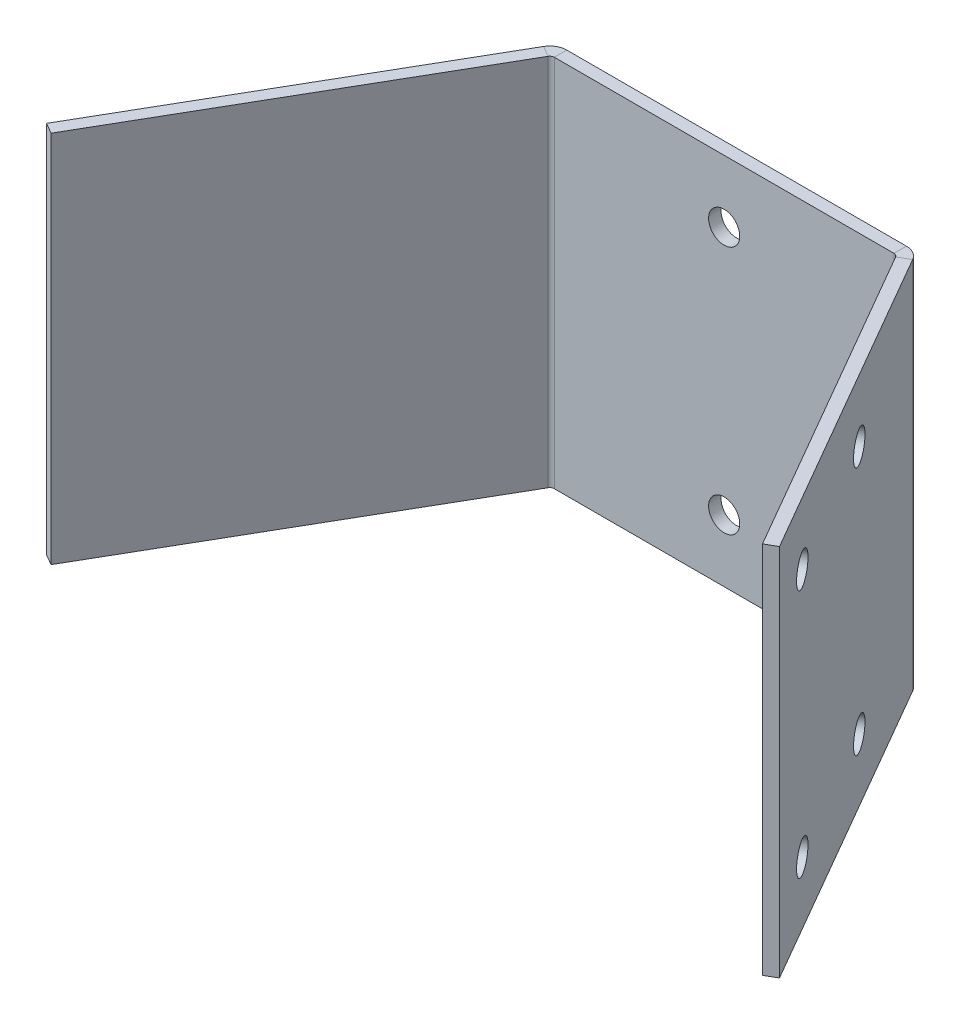
ISO-10303-21;
HEADER;
FILE_DESCRIPTION(('STEP AP214'),'2;1');
FILE_NAME('part.step','',(''),(''),'','','');
FILE_SCHEMA(('AUTOMOTIVE_DESIGN { 1 0 10303 214 1 1 1 1 }'));
ENDSEC;
DATA;
#1=APPLICATION_CONTEXT('core data for automotive mechanical design processes');
#2=APPLICATION_PROTOCOL_DEFINITION('international standard','automotive_design',2000,#1);
#3=PRODUCT_CONTEXT('',#1,'mechanical');
#4=PRODUCT('Part','Part','',(#3));
#5=PRODUCT_RELATED_PRODUCT_CATEGORY('part','',(#4));
#6=PRODUCT_DEFINITION_FORMATION('','',#4);
#7=PRODUCT_DEFINITION_CONTEXT('part definition',#1,'design');
#8=PRODUCT_DEFINITION('design','',#6,#7);
#9=PRODUCT_DEFINITION_SHAPE('','',#8);
#10=(LENGTH_UNIT() NAMED_UNIT(*) SI_UNIT(.MILLI.,.METRE.));
#11=(NAMED_UNIT(*) PLANE_ANGLE_UNIT() SI_UNIT($,.RADIAN.));
#12=(NAMED_UNIT(*) SI_UNIT($,.STERADIAN.) SOLID_ANGLE_UNIT());
#13=UNCERTAINTY_MEASURE_WITH_UNIT(LENGTH_MEASURE(1.E-05),#10,'distance_accuracy_value','');
#14=(GEOMETRIC_REPRESENTATION_CONTEXT(3) GLOBAL_UNCERTAINTY_ASSIGNED_CONTEXT((#13)) GLOBAL_UNIT_ASSIGNED_CONTEXT((#10,
#11,#12)) REPRESENTATION_CONTEXT('',''));
#15=CARTESIAN_POINT('',(0.,0.,0.));
#16=DIRECTION('',(0.,0.,1.));
#17=DIRECTION('',(1.,0.,0.));
#18=AXIS2_PLACEMENT_3D('',#15,#16,#17);
#19=CARTESIAN_POINT('',(0.,0.,-2.));
#20=DIRECTION('',(0.,0.,1.));
#21=DIRECTION('',(1.,0.,0.));
#22=AXIS2_PLACEMENT_3D('',#19,#20,#21);
#23=PLANE('',#22);
#24=CARTESIAN_POINT('',(0.,-20.,-2.));
#25=DIRECTION('',(0.,0.,-1.));
#26=DIRECTION('',(1.,0.,0.));
#27=AXIS2_PLACEMENT_3D('',#24,#25,#26);
#28=CIRCLE('',#27,2.5);
#29=CARTESIAN_POINT('',(2.50000000000001,-20.,-2.));
#30=VERTEX_POINT('',#29);
#31=EDGE_CURVE('E296',#30,#30,#28,.T.);
#32=ORIENTED_EDGE('',*,*,#31,.F.);
#33=EDGE_LOOP('',(#32));
#34=FACE_BOUND('',#33,.T.);
#35=CARTESIAN_POINT('',(0.,20.,-2.));
#36=DIRECTION('',(0.,0.,-1.));
#37=DIRECTION('',(-1.,0.,0.));
#38=AXIS2_PLACEMENT_3D('',#35,#36,#37);
#39=CIRCLE('',#38,2.5);
#40=CARTESIAN_POINT('',(-2.5,20.,-2.));
#41=VERTEX_POINT('',#40);
#42=EDGE_CURVE('E292',#41,#41,#39,.T.);
#43=ORIENTED_EDGE('',*,*,#42,.F.);
#44=EDGE_LOOP('',(#43));
#45=FACE_BOUND('',#44,.T.);
#46=DIRECTION('',(0.,-1.,0.));
#47=VECTOR('',#46,1.);
#48=CARTESIAN_POINT('',(-27.2653227149564,-30.,-2.00000000000001));
#49=LINE('',#48,#47);
#50=CARTESIAN_POINT('',(-27.2653227149564,-30.,-2.00000000000001));
#51=VERTEX_POINT('',#50);
#52=CARTESIAN_POINT('',(-27.2653227149564,30.,-2.));
#53=VERTEX_POINT('',#52);
#54=EDGE_CURVE('E211',#51,#53,#49,.F.);
#55=ORIENTED_EDGE('',*,*,#54,.T.);
#56=DIRECTION('',(-1.,0.,0.));
#57=VECTOR('',#56,1.);
#58=CARTESIAN_POINT('',(-30.,30.,-2.));
#59=LINE('',#58,#57);
#60=CARTESIAN_POINT('',(27.2653227149564,30.,-1.99999999999999));
#61=VERTEX_POINT('',#60);
#62=EDGE_CURVE('E86',#61,#53,#59,.T.);
#63=ORIENTED_EDGE('',*,*,#62,.F.);
#64=DIRECTION('',(0.,1.,0.));
#65=VECTOR('',#64,1.);
#66=CARTESIAN_POINT('',(27.2653227149564,30.,-1.99999999999999));
#67=LINE('',#66,#65);
#68=CARTESIAN_POINT('',(27.2653227149564,-30.,-2.));
#69=VERTEX_POINT('',#68);
#70=EDGE_CURVE('E264',#61,#69,#67,.F.);
#71=ORIENTED_EDGE('',*,*,#70,.T.);
#72=DIRECTION('',(1.,0.,0.));
#73=VECTOR('',#72,1.);
#74=CARTESIAN_POINT('',(-30.,-30.,-2.));
#75=LINE('',#74,#73);
#76=EDGE_CURVE('E13',#51,#69,#75,.T.);
#77=ORIENTED_EDGE('',*,*,#76,.F.);
#78=EDGE_LOOP('',(#55,#63,#71,#77));
#79=FACE_BOUND('',#78,.T.);
#80=ADVANCED_FACE('F77',(#34,#45,#79),#23,.F.);
#81=CARTESIAN_POINT('',(0.,0.,0.));
#82=DIRECTION('',(0.,0.,1.));
#83=DIRECTION('',(1.,0.,0.));
#84=AXIS2_PLACEMENT_3D('',#81,#82,#83);
#85=PLANE('',#84);
#86=CARTESIAN_POINT('',(0.,-20.,0.));
#87=DIRECTION('',(0.,0.,1.));
#88=DIRECTION('',(1.,0.,0.));
#89=AXIS2_PLACEMENT_3D('',#86,#87,#88);
#90=CIRCLE('',#89,2.5);
#91=CARTESIAN_POINT('',(2.50000000000001,-20.,0.));
#92=VERTEX_POINT('',#91);
#93=EDGE_CURVE('E293',#92,#92,#90,.T.);
#94=ORIENTED_EDGE('',*,*,#93,.F.);
#95=EDGE_LOOP('',(#94));
#96=FACE_BOUND('',#95,.T.);
#97=CARTESIAN_POINT('',(0.,20.,0.));
#98=DIRECTION('',(0.,0.,1.));
#99=DIRECTION('',(1.,0.,0.));
#100=AXIS2_PLACEMENT_3D('',#97,#98,#99);
#101=CIRCLE('',#100,2.5);
#102=CARTESIAN_POINT('',(2.5,20.,0.));
#103=VERTEX_POINT('',#102);
#104=EDGE_CURVE('E210',#103,#103,#101,.T.);
#105=ORIENTED_EDGE('',*,*,#104,.F.);
#106=EDGE_LOOP('',(#105));
#107=FACE_BOUND('',#106,.T.);
#108=DIRECTION('',(-1.,0.,0.));
#109=VECTOR('',#108,1.);
#110=CARTESIAN_POINT('',(-30.,30.,0.));
#111=LINE('',#110,#109);
#112=CARTESIAN_POINT('',(27.2653227149564,30.,0.));
#113=VERTEX_POINT('',#112);
#114=CARTESIAN_POINT('',(-27.2653227149564,30.,0.));
#115=VERTEX_POINT('',#114);
#116=EDGE_CURVE('E282',#113,#115,#111,.T.);
#117=ORIENTED_EDGE('',*,*,#116,.T.);
#118=DIRECTION('',(0.,-1.,0.));
#119=VECTOR('',#118,1.);
#120=CARTESIAN_POINT('',(-27.2653227149564,-30.,0.));
#121=LINE('',#120,#119);
#122=CARTESIAN_POINT('',(-27.2653227149564,-30.,0.));
#123=VERTEX_POINT('',#122);
#124=EDGE_CURVE('E223',#123,#115,#121,.F.);
#125=ORIENTED_EDGE('',*,*,#124,.F.);
#126=DIRECTION('',(1.,0.,0.));
#127=VECTOR('',#126,1.);
#128=CARTESIAN_POINT('',(-30.,-30.,0.));
#129=LINE('',#128,#127);
#130=CARTESIAN_POINT('',(27.2653227149564,-30.,0.));
#131=VERTEX_POINT('',#130);
#132=EDGE_CURVE('E286',#123,#131,#129,.T.);
#133=ORIENTED_EDGE('',*,*,#132,.T.);
#134=DIRECTION('',(0.,1.,0.));
#135=VECTOR('',#134,1.);
#136=CARTESIAN_POINT('',(27.2653227149564,30.,0.));
#137=LINE('',#136,#135);
#138=EDGE_CURVE('E94',#113,#131,#137,.F.);
#139=ORIENTED_EDGE('',*,*,#138,.F.);
#140=EDGE_LOOP('',(#117,#125,#133,#139));
#141=FACE_BOUND('',#140,.T.);
#142=ADVANCED_FACE('F348',(#96,#107,#141),#85,.T.);
#143=CARTESIAN_POINT('',(-30.,-30.,-2.));
#144=DIRECTION('',(0.,-1.,0.));
#145=DIRECTION('',(0.,0.,-1.));
#146=AXIS2_PLACEMENT_3D('',#143,#144,#145);
#147=PLANE('',#146);
#148=ORIENTED_EDGE('',*,*,#132,.F.);
#149=DIRECTION('',(0.,0.,-1.));
#150=VECTOR('',#149,1.);
#151=CARTESIAN_POINT('',(-27.2653227149564,-30.,0.));
#152=LINE('',#151,#150);
#153=EDGE_CURVE('E217',#123,#51,#152,.T.);
#154=ORIENTED_EDGE('',*,*,#153,.T.);
#155=ORIENTED_EDGE('',*,*,#76,.T.);
#156=DIRECTION('',(0.,0.,-1.));
#157=VECTOR('',#156,1.);
#158=CARTESIAN_POINT('',(27.2653227149564,-30.,0.));
#159=LINE('',#158,#157);
#160=EDGE_CURVE('E279',#131,#69,#159,.T.);
#161=ORIENTED_EDGE('',*,*,#160,.F.);
#162=EDGE_LOOP('',(#148,#154,#155,#161));
#163=FACE_BOUND('',#162,.T.);
#164=ADVANCED_FACE('F354',(#163),#147,.T.);
#165=CARTESIAN_POINT('',(-30.,30.,-2.));
#166=DIRECTION('',(0.,1.,0.));
#167=DIRECTION('',(0.,0.,1.));
#168=AXIS2_PLACEMENT_3D('',#165,#166,#167);
#169=PLANE('',#168);
#170=DIRECTION('',(0.,0.,-1.));
#171=VECTOR('',#170,1.);
#172=CARTESIAN_POINT('',(-27.2653227149564,30.,0.));
#173=LINE('',#172,#171);
#174=EDGE_CURVE('E229',#115,#53,#173,.T.);
#175=ORIENTED_EDGE('',*,*,#174,.F.);
#176=ORIENTED_EDGE('',*,*,#116,.F.);
#177=DIRECTION('',(0.,0.,-1.));
#178=VECTOR('',#177,1.);
#179=CARTESIAN_POINT('',(27.2653227149564,30.,0.));
#180=LINE('',#179,#178);
#181=EDGE_CURVE('E270',#113,#61,#180,.T.);
#182=ORIENTED_EDGE('',*,*,#181,.T.);
#183=ORIENTED_EDGE('',*,*,#62,.T.);
#184=EDGE_LOOP('',(#175,#176,#182,#183));
#185=FACE_BOUND('',#184,.T.);
#186=ADVANCED_FACE('F79',(#185),#169,.T.);
#187=CARTESIAN_POINT('',(27.2653227149564,-30.,0.736599999999996));
#188=DIRECTION('',(0.,-1.,0.));
#189=DIRECTION('',(0.,0.,-1.));
#190=AXIS2_PLACEMENT_3D('',#187,#188,#189);
#191=PLANE('',#190);
#192=DIRECTION('',(-0.866025403784436,0.,0.500000000000004));
#193=VECTOR('',#192,1.);
#194=CARTESIAN_POINT('',(29.6352878349529,-30.,-0.631700000000012));
#195=LINE('',#194,#193);
#196=CARTESIAN_POINT('',(27.903237027384,-30.,0.368299999999994));
#197=VERTEX_POINT('',#196);
#198=CARTESIAN_POINT('',(29.6352878349529,-30.,-0.631700000000011));
#199=VERTEX_POINT('',#198);
#200=EDGE_CURVE('E232',#197,#199,#195,.F.);
#201=ORIENTED_EDGE('',*,*,#200,.F.);
#202=CARTESIAN_POINT('',(27.2653227149564,-30.,0.736599999999996));
#203=DIRECTION('',(0.,1.,0.));
#204=DIRECTION('',(0.,0.,1.));
#205=AXIS2_PLACEMENT_3D('',#202,#203,#204);
#206=CIRCLE('',#205,0.736599999999998);
#207=EDGE_CURVE('E273',#131,#197,#206,.F.);
#208=ORIENTED_EDGE('',*,*,#207,.F.);
#209=ORIENTED_EDGE('',*,*,#160,.T.);
#210=CARTESIAN_POINT('',(27.2653227149564,-30.,0.736599999999996));
#211=DIRECTION('',(0.,1.,0.));
#212=DIRECTION('',(0.,0.,1.));
#213=AXIS2_PLACEMENT_3D('',#210,#211,#212);
#214=CIRCLE('',#213,2.7366);
#215=EDGE_CURVE('E266',#69,#199,#214,.F.);
#216=ORIENTED_EDGE('',*,*,#215,.T.);
#217=EDGE_LOOP('',(#201,#208,#209,#216));
#218=FACE_BOUND('',#217,.T.);
#219=ADVANCED_FACE('F366',(#218),#191,.T.);
#220=CARTESIAN_POINT('',(27.2653227149564,30.,0.736600000000005));
#221=DIRECTION('',(0.,-1.,0.));
#222=DIRECTION('',(0.,0.,-1.));
#223=AXIS2_PLACEMENT_3D('',#220,#221,#222);
#224=PLANE('',#223);
#225=CARTESIAN_POINT('',(27.2653227149564,30.,0.736600000000005));
#226=DIRECTION('',(0.,1.,0.));
#227=DIRECTION('',(0.,0.,1.));
#228=AXIS2_PLACEMENT_3D('',#225,#226,#227);
#229=CIRCLE('',#228,0.736599999999998);
#230=CARTESIAN_POINT('',(27.903237027384,30.,0.368300000000003));
#231=VERTEX_POINT('',#230);
#232=EDGE_CURVE('E237',#231,#113,#229,.T.);
#233=ORIENTED_EDGE('',*,*,#232,.F.);
#234=DIRECTION('',(-0.866025403784436,0.,0.500000000000004));
#235=VECTOR('',#234,1.);
#236=CARTESIAN_POINT('',(27.903237027384,30.,0.368299999999999));
#237=LINE('',#236,#235);
#238=CARTESIAN_POINT('',(29.6352878349529,30.,-0.631700000000007));
#239=VERTEX_POINT('',#238);
#240=EDGE_CURVE('E257',#231,#239,#237,.F.);
#241=ORIENTED_EDGE('',*,*,#240,.T.);
#242=CARTESIAN_POINT('',(27.2653227149564,30.,0.736600000000005));
#243=DIRECTION('',(0.,1.,0.));
#244=DIRECTION('',(0.,0.,1.));
#245=AXIS2_PLACEMENT_3D('',#242,#243,#244);
#246=CIRCLE('',#245,2.7366);
#247=EDGE_CURVE('E267',#239,#61,#246,.T.);
#248=ORIENTED_EDGE('',*,*,#247,.T.);
#249=ORIENTED_EDGE('',*,*,#181,.F.);
#250=EDGE_LOOP('',(#233,#241,#248,#249));
#251=FACE_BOUND('',#250,.T.);
#252=ADVANCED_FACE('F360',(#251),#224,.F.);
#253=CARTESIAN_POINT('',(27.2653227149564,30.,0.736600000000005));
#254=DIRECTION('',(0.,1.,0.));
#255=DIRECTION('',(0.866025403784436,0.,-0.500000000000004));
#256=AXIS2_PLACEMENT_3D('',#253,#254,#255);
#257=CYLINDRICAL_SURFACE('',#256,2.7366);
#258=ORIENTED_EDGE('',*,*,#70,.F.);
#259=ORIENTED_EDGE('',*,*,#247,.F.);
#260=DIRECTION('',(0.,1.,0.));
#261=VECTOR('',#260,1.);
#262=CARTESIAN_POINT('',(29.6352878349529,-30.,-0.631700000000012));
#263=LINE('',#262,#261);
#264=EDGE_CURVE('E255',#239,#199,#263,.F.);
#265=ORIENTED_EDGE('',*,*,#264,.T.);
#266=ORIENTED_EDGE('',*,*,#215,.F.);
#267=EDGE_LOOP('',(#258,#259,#265,#266));
#268=FACE_BOUND('',#267,.T.);
#269=ADVANCED_FACE('F381',(#268),#257,.T.);
#270=CARTESIAN_POINT('',(27.2653227149564,30.,0.736600000000005));
#271=DIRECTION('',(0.,1.,0.));
#272=DIRECTION('',(0.866025403784436,0.,-0.500000000000004));
#273=AXIS2_PLACEMENT_3D('',#270,#271,#272);
#274=CYLINDRICAL_SURFACE('',#273,0.736599999999998);
#275=ORIENTED_EDGE('',*,*,#138,.T.);
#276=ORIENTED_EDGE('',*,*,#207,.T.);
#277=DIRECTION('',(0.,1.,0.));
#278=VECTOR('',#277,1.);
#279=CARTESIAN_POINT('',(27.903237027384,-30.,0.368299999999996));
#280=LINE('',#279,#278);
#281=EDGE_CURVE('E260',#197,#231,#280,.T.);
#282=ORIENTED_EDGE('',*,*,#281,.T.);
#283=ORIENTED_EDGE('',*,*,#232,.T.);
#284=EDGE_LOOP('',(#275,#276,#282,#283));
#285=FACE_BOUND('',#284,.T.);
#286=ADVANCED_FACE('F404',(#285),#274,.F.);
#287=CARTESIAN_POINT('',(58.845299461621,30.,49.9615242270662));
#288=DIRECTION('',(0.,-1.,0.));
#289=DIRECTION('',(0.,0.,-1.));
#290=AXIS2_PLACEMENT_3D('',#287,#288,#289);
#291=PLANE('',#290);
#292=ORIENTED_EDGE('',*,*,#240,.F.);
#293=DIRECTION('',(-0.500000000000004,0.,-0.866025403784436));
#294=VECTOR('',#293,1.);
#295=CARTESIAN_POINT('',(57.1132486540521,30.,50.9615242270662));
#296=LINE('',#295,#294);
#297=CARTESIAN_POINT('',(57.1132486540521,30.,50.9615242270662));
#298=VERTEX_POINT('',#297);
#299=EDGE_CURVE('E253',#231,#298,#296,.F.);
#300=ORIENTED_EDGE('',*,*,#299,.T.);
#301=DIRECTION('',(-0.866025403784436,0.,0.500000000000004));
#302=VECTOR('',#301,1.);
#303=CARTESIAN_POINT('',(58.845299461621,30.,49.9615242270662));
#304=LINE('',#303,#302);
#305=CARTESIAN_POINT('',(58.845299461621,30.,49.9615242270661));
#306=VERTEX_POINT('',#305);
#307=EDGE_CURVE('E234',#306,#298,#304,.T.);
#308=ORIENTED_EDGE('',*,*,#307,.F.);
#309=DIRECTION('',(0.500000000000004,0.,0.866025403784436));
#310=VECTOR('',#309,1.);
#311=CARTESIAN_POINT('',(21.9226497308102,30.,-13.9903810567667));
#312=LINE('',#311,#310);
#313=EDGE_CURVE('E246',#239,#306,#312,.T.);
#314=ORIENTED_EDGE('',*,*,#313,.F.);
#315=EDGE_LOOP('',(#292,#300,#308,#314));
#316=FACE_BOUND('',#315,.T.);
#317=ADVANCED_FACE('F391',(#316),#291,.F.);
#318=CARTESIAN_POINT('',(29.4226497308104,-30.,-1.00000000000001));
#319=DIRECTION('',(0.,1.,0.));
#320=DIRECTION('',(0.,0.,1.));
#321=AXIS2_PLACEMENT_3D('',#318,#319,#320);
#322=PLANE('',#321);
#323=ORIENTED_EDGE('',*,*,#200,.T.);
#324=DIRECTION('',(-0.500000000000004,0.,-0.866025403784436));
#325=VECTOR('',#324,1.);
#326=CARTESIAN_POINT('',(21.9226497308102,-30.,-13.9903810567667));
#327=LINE('',#326,#325);
#328=CARTESIAN_POINT('',(58.845299461621,-30.,49.9615242270662));
#329=VERTEX_POINT('',#328);
#330=EDGE_CURVE('E241',#329,#199,#327,.T.);
#331=ORIENTED_EDGE('',*,*,#330,.F.);
#332=DIRECTION('',(-0.866025403784436,0.,0.500000000000004));
#333=VECTOR('',#332,1.);
#334=CARTESIAN_POINT('',(58.845299461621,-30.,49.9615242270662));
#335=LINE('',#334,#333);
#336=CARTESIAN_POINT('',(57.1132486540521,-30.,50.9615242270662));
#337=VERTEX_POINT('',#336);
#338=EDGE_CURVE('E238',#329,#337,#335,.T.);
#339=ORIENTED_EDGE('',*,*,#338,.T.);
#340=DIRECTION('',(0.500000000000004,0.,0.866025403784436));
#341=VECTOR('',#340,1.);
#342=CARTESIAN_POINT('',(27.6905989232415,-30.,0.));
#343=LINE('',#342,#341);
#344=EDGE_CURVE('E248',#337,#197,#343,.F.);
#345=ORIENTED_EDGE('',*,*,#344,.T.);
#346=EDGE_LOOP('',(#323,#331,#339,#345));
#347=FACE_BOUND('',#346,.T.);
#348=ADVANCED_FACE('F399',(#347),#322,.F.);
#349=CARTESIAN_POINT('',(21.9226497308102,0.,-13.9903810567667));
#350=DIRECTION('',(-0.866025403784436,0.,0.500000000000004));
#351=DIRECTION('',(0.500000000000004,0.,0.866025403784436));
#352=AXIS2_PLACEMENT_3D('',#349,#350,#351);
#353=PLANE('',#352);
#354=CARTESIAN_POINT('',(41.3452994616208,20.,19.6506350946109));
#355=DIRECTION('',(0.866025403784436,0.,-0.500000000000004));
#356=DIRECTION('',(-0.500000000000004,0.,-0.866025403784436));
#357=AXIS2_PLACEMENT_3D('',#354,#355,#356);
#358=CIRCLE('',#357,2.5);
#359=CARTESIAN_POINT('',(40.0952994616208,20.,17.4855715851498));
#360=VERTEX_POINT('',#359);
#361=EDGE_CURVE('E304',#360,#360,#358,.T.);
#362=ORIENTED_EDGE('',*,*,#361,.F.);
#363=EDGE_LOOP('',(#362));
#364=FACE_BOUND('',#363,.T.);
#365=CARTESIAN_POINT('',(41.3452994616208,-20.,19.6506350946109));
#366=DIRECTION('',(0.866025403784436,0.,-0.500000000000004));
#367=DIRECTION('',(0.500000000000004,0.,0.866025403784436));
#368=AXIS2_PLACEMENT_3D('',#365,#366,#367);
#369=CIRCLE('',#368,2.5);
#370=CARTESIAN_POINT('',(42.5952994616208,-20.,21.815698604072));
#371=VERTEX_POINT('',#370);
#372=EDGE_CURVE('E685',#371,#371,#369,.T.);
#373=ORIENTED_EDGE('',*,*,#372,.F.);
#374=EDGE_LOOP('',(#373));
#375=FACE_BOUND('',#374,.T.);
#376=CARTESIAN_POINT('',(53.8452994616209,-20.,41.3012701892218));
#377=DIRECTION('',(0.866025403784436,0.,-0.500000000000004));
#378=DIRECTION('',(0.500000000000004,0.,0.866025403784436));
#379=AXIS2_PLACEMENT_3D('',#376,#377,#378);
#380=CIRCLE('',#379,2.5);
#381=CARTESIAN_POINT('',(55.095299461621,-20.,43.4663336986829));
#382=VERTEX_POINT('',#381);
#383=EDGE_CURVE('E317',#382,#382,#380,.T.);
#384=ORIENTED_EDGE('',*,*,#383,.F.);
#385=EDGE_LOOP('',(#384));
#386=FACE_BOUND('',#385,.T.);
#387=CARTESIAN_POINT('',(53.8452994616209,20.,41.3012701892218));
#388=DIRECTION('',(0.866025403784436,0.,-0.500000000000004));
#389=DIRECTION('',(-0.500000000000004,0.,-0.866025403784436));
#390=AXIS2_PLACEMENT_3D('',#387,#388,#389);
#391=CIRCLE('',#390,2.5);
#392=CARTESIAN_POINT('',(52.5952994616209,20.,39.1362066797607));
#393=VERTEX_POINT('',#392);
#394=EDGE_CURVE('E300',#393,#393,#391,.T.);
#395=ORIENTED_EDGE('',*,*,#394,.F.);
#396=EDGE_LOOP('',(#395));
#397=FACE_BOUND('',#396,.T.);
#398=ORIENTED_EDGE('',*,*,#264,.F.);
#399=ORIENTED_EDGE('',*,*,#313,.T.);
#400=DIRECTION('',(0.,-1.,0.));
#401=VECTOR('',#400,1.);
#402=CARTESIAN_POINT('',(58.845299461621,0.,49.9615242270661));
#403=LINE('',#402,#401);
#404=EDGE_CURVE('E244',#306,#329,#403,.T.);
#405=ORIENTED_EDGE('',*,*,#404,.T.);
#406=ORIENTED_EDGE('',*,*,#330,.T.);
#407=EDGE_LOOP('',(#398,#399,#405,#406));
#408=FACE_BOUND('',#407,.T.);
#409=ADVANCED_FACE('F388',(#364,#375,#386,#397,#408),#353,.F.);
#410=CARTESIAN_POINT('',(20.1905989232414,0.,-12.9903810567666));
#411=DIRECTION('',(-0.866025403784436,0.,0.500000000000004));
#412=DIRECTION('',(0.500000000000004,0.,0.866025403784436));
#413=AXIS2_PLACEMENT_3D('',#410,#411,#412);
#414=PLANE('',#413);
#415=CARTESIAN_POINT('',(39.613248654052,20.,20.6506350946109));
#416=DIRECTION('',(-0.866025403784436,0.,0.500000000000004));
#417=DIRECTION('',(0.500000000000004,0.,0.866025403784436));
#418=AXIS2_PLACEMENT_3D('',#415,#416,#417);
#419=CIRCLE('',#418,2.5);
#420=CARTESIAN_POINT('',(40.863248654052,20.,22.815698604072));
#421=VERTEX_POINT('',#420);
#422=EDGE_CURVE('E81',#421,#421,#419,.T.);
#423=ORIENTED_EDGE('',*,*,#422,.F.);
#424=EDGE_LOOP('',(#423));
#425=FACE_BOUND('',#424,.T.);
#426=CARTESIAN_POINT('',(39.613248654052,-20.,20.6506350946109));
#427=DIRECTION('',(-0.866025403784436,0.,0.500000000000004));
#428=DIRECTION('',(0.500000000000004,0.,0.866025403784436));
#429=AXIS2_PLACEMENT_3D('',#426,#427,#428);
#430=CIRCLE('',#429,2.5);
#431=CARTESIAN_POINT('',(40.863248654052,-20.,22.815698604072));
#432=VERTEX_POINT('',#431);
#433=EDGE_CURVE('E303',#432,#432,#430,.T.);
#434=ORIENTED_EDGE('',*,*,#433,.F.);
#435=EDGE_LOOP('',(#434));
#436=FACE_BOUND('',#435,.T.);
#437=CARTESIAN_POINT('',(52.1132486540521,-20.,42.3012701892218));
#438=DIRECTION('',(-0.866025403784436,0.,0.500000000000004));
#439=DIRECTION('',(0.500000000000004,0.,0.866025403784436));
#440=AXIS2_PLACEMENT_3D('',#437,#438,#439);
#441=CIRCLE('',#440,2.5);
#442=CARTESIAN_POINT('',(53.3632486540521,-20.,44.4663336986829));
#443=VERTEX_POINT('',#442);
#444=EDGE_CURVE('E301',#443,#443,#441,.T.);
#445=ORIENTED_EDGE('',*,*,#444,.F.);
#446=EDGE_LOOP('',(#445));
#447=FACE_BOUND('',#446,.T.);
#448=CARTESIAN_POINT('',(52.1132486540521,20.,42.3012701892218));
#449=DIRECTION('',(-0.866025403784436,0.,0.500000000000004));
#450=DIRECTION('',(0.500000000000004,0.,0.866025403784436));
#451=AXIS2_PLACEMENT_3D('',#448,#449,#450);
#452=CIRCLE('',#451,2.5);
#453=CARTESIAN_POINT('',(53.3632486540521,20.,44.4663336986829));
#454=VERTEX_POINT('',#453);
#455=EDGE_CURVE('E297',#454,#454,#452,.T.);
#456=ORIENTED_EDGE('',*,*,#455,.F.);
#457=EDGE_LOOP('',(#456));
#458=FACE_BOUND('',#457,.T.);
#459=ORIENTED_EDGE('',*,*,#299,.F.);
#460=ORIENTED_EDGE('',*,*,#281,.F.);
#461=ORIENTED_EDGE('',*,*,#344,.F.);
#462=DIRECTION('',(0.,1.,0.));
#463=VECTOR('',#462,1.);
#464=CARTESIAN_POINT('',(57.1132486540521,-30.,50.9615242270662));
#465=LINE('',#464,#463);
#466=EDGE_CURVE('E251',#298,#337,#465,.F.);
#467=ORIENTED_EDGE('',*,*,#466,.F.);
#468=EDGE_LOOP('',(#459,#460,#461,#467));
#469=FACE_BOUND('',#468,.T.);
#470=ADVANCED_FACE('F406',(#425,#436,#447,#458,#469),#414,.T.);
#471=CARTESIAN_POINT('',(58.845299461621,-30.,49.9615242270662));
#472=DIRECTION('',(-0.500000000000004,0.,-0.866025403784436));
#473=DIRECTION('',(-0.866025403784436,0.,0.500000000000004));
#474=AXIS2_PLACEMENT_3D('',#471,#472,#473);
#475=PLANE('',#474);
#476=ORIENTED_EDGE('',*,*,#466,.T.);
#477=ORIENTED_EDGE('',*,*,#338,.F.);
#478=ORIENTED_EDGE('',*,*,#404,.F.);
#479=ORIENTED_EDGE('',*,*,#307,.T.);
#480=EDGE_LOOP('',(#476,#477,#478,#479));
#481=FACE_BOUND('',#480,.T.);
#482=ADVANCED_FACE('F396',(#481),#475,.F.);
#483=CARTESIAN_POINT('',(-27.2653227149564,30.,0.7366));
#484=DIRECTION('',(0.,1.,0.));
#485=DIRECTION('',(0.,0.,1.));
#486=AXIS2_PLACEMENT_3D('',#483,#484,#485);
#487=PLANE('',#486);
#488=DIRECTION('',(0.866025403784436,0.,0.500000000000004));
#489=VECTOR('',#488,1.);
#490=CARTESIAN_POINT('',(-29.6352878349529,30.,-0.631700000000014));
#491=LINE('',#490,#489);
#492=CARTESIAN_POINT('',(-27.903237027384,30.,0.368299999999993));
#493=VERTEX_POINT('',#492);
#494=CARTESIAN_POINT('',(-29.6352878349529,30.,-0.631700000000016));
#495=VERTEX_POINT('',#494);
#496=EDGE_CURVE('E192',#493,#495,#491,.F.);
#497=ORIENTED_EDGE('',*,*,#496,.F.);
#498=CARTESIAN_POINT('',(-27.2653227149564,30.,0.7366));
#499=DIRECTION('',(0.,-1.,0.));
#500=DIRECTION('',(0.,0.,-1.));
#501=AXIS2_PLACEMENT_3D('',#498,#499,#500);
#502=CIRCLE('',#501,0.736600000000007);
#503=EDGE_CURVE('E220',#115,#493,#502,.F.);
#504=ORIENTED_EDGE('',*,*,#503,.F.);
#505=ORIENTED_EDGE('',*,*,#174,.T.);
#506=CARTESIAN_POINT('',(-27.2653227149564,30.,0.7366));
#507=DIRECTION('',(0.,-1.,0.));
#508=DIRECTION('',(0.,0.,-1.));
#509=AXIS2_PLACEMENT_3D('',#506,#507,#508);
#510=CIRCLE('',#509,2.73660000000001);
#511=EDGE_CURVE('E213',#53,#495,#510,.F.);
#512=ORIENTED_EDGE('',*,*,#511,.T.);
#513=EDGE_LOOP('',(#497,#504,#505,#512));
#514=FACE_BOUND('',#513,.T.);
#515=ADVANCED_FACE('F371',(#514),#487,.T.);
#516=CARTESIAN_POINT('',(-27.2653227149564,-30.,0.7366));
#517=DIRECTION('',(0.,1.,0.));
#518=DIRECTION('',(0.,0.,1.));
#519=AXIS2_PLACEMENT_3D('',#516,#517,#518);
#520=PLANE('',#519);
#521=CARTESIAN_POINT('',(-27.2653227149564,-30.,0.7366));
#522=DIRECTION('',(0.,-1.,0.));
#523=DIRECTION('',(0.,0.,-1.));
#524=AXIS2_PLACEMENT_3D('',#521,#522,#523);
#525=CIRCLE('',#524,0.736600000000007);
#526=CARTESIAN_POINT('',(-27.903237027384,-30.,0.368299999999993));
#527=VERTEX_POINT('',#526);
#528=EDGE_CURVE('E226',#527,#123,#525,.T.);
#529=ORIENTED_EDGE('',*,*,#528,.F.);
#530=DIRECTION('',(0.866025403784436,0.,0.500000000000004));
#531=VECTOR('',#530,1.);
#532=CARTESIAN_POINT('',(-27.903237027384,-30.,0.368299999999992));
#533=LINE('',#532,#531);
#534=CARTESIAN_POINT('',(-29.6352878349529,-30.,-0.631700000000008));
#535=VERTEX_POINT('',#534);
#536=EDGE_CURVE('E204',#527,#535,#533,.F.);
#537=ORIENTED_EDGE('',*,*,#536,.T.);
#538=CARTESIAN_POINT('',(-27.2653227149564,-30.,0.7366));
#539=DIRECTION('',(0.,-1.,0.));
#540=DIRECTION('',(0.,0.,-1.));
#541=AXIS2_PLACEMENT_3D('',#538,#539,#540);
#542=CIRCLE('',#541,2.73660000000001);
#543=EDGE_CURVE('E214',#535,#51,#542,.T.);
#544=ORIENTED_EDGE('',*,*,#543,.T.);
#545=ORIENTED_EDGE('',*,*,#153,.F.);
#546=EDGE_LOOP('',(#529,#537,#544,#545));
#547=FACE_BOUND('',#546,.T.);
#548=ADVANCED_FACE('F334',(#547),#520,.F.);
#549=CARTESIAN_POINT('',(-27.2653227149564,-30.,0.7366));
#550=DIRECTION('',(0.,-1.,0.));
#551=DIRECTION('',(-0.866025403784436,0.,-0.500000000000004));
#552=AXIS2_PLACEMENT_3D('',#549,#550,#551);
#553=CYLINDRICAL_SURFACE('',#552,2.73660000000001);
#554=ORIENTED_EDGE('',*,*,#54,.F.);
#555=ORIENTED_EDGE('',*,*,#543,.F.);
#556=DIRECTION('',(0.,-1.,0.));
#557=VECTOR('',#556,1.);
#558=CARTESIAN_POINT('',(-29.6352878349529,30.,-0.631700000000009));
#559=LINE('',#558,#557);
#560=EDGE_CURVE('E202',#535,#495,#559,.F.);
#561=ORIENTED_EDGE('',*,*,#560,.T.);
#562=ORIENTED_EDGE('',*,*,#511,.F.);
#563=EDGE_LOOP('',(#554,#555,#561,#562));
#564=FACE_BOUND('',#563,.T.);
#565=ADVANCED_FACE('F343',(#564),#553,.T.);
#566=CARTESIAN_POINT('',(-27.2653227149564,-30.,0.7366));
#567=DIRECTION('',(0.,-1.,0.));
#568=DIRECTION('',(-0.866025403784436,0.,-0.500000000000004));
#569=AXIS2_PLACEMENT_3D('',#566,#567,#568);
#570=CYLINDRICAL_SURFACE('',#569,0.736600000000007);
#571=ORIENTED_EDGE('',*,*,#124,.T.);
#572=ORIENTED_EDGE('',*,*,#503,.T.);
#573=DIRECTION('',(0.,-1.,0.));
#574=VECTOR('',#573,1.);
#575=CARTESIAN_POINT('',(-27.903237027384,30.,0.368299999999999));
#576=LINE('',#575,#574);
#577=EDGE_CURVE('E207',#493,#527,#576,.T.);
#578=ORIENTED_EDGE('',*,*,#577,.T.);
#579=ORIENTED_EDGE('',*,*,#528,.T.);
#580=EDGE_LOOP('',(#571,#572,#578,#579));
#581=FACE_BOUND('',#580,.T.);
#582=ADVANCED_FACE('F329',(#581),#570,.F.);
#583=CARTESIAN_POINT('',(-58.845299461621,-30.,49.9615242270662));
#584=DIRECTION('',(0.,1.,0.));
#585=DIRECTION('',(-1.,0.,0.));
#586=AXIS2_PLACEMENT_3D('',#583,#584,#585);
#587=PLANE('',#586);
#588=ORIENTED_EDGE('',*,*,#536,.F.);
#589=DIRECTION('',(0.500000000000004,0.,-0.866025403784436));
#590=VECTOR('',#589,1.);
#591=CARTESIAN_POINT('',(-57.1132486540521,-30.,50.9615242270662));
#592=LINE('',#591,#590);
#593=CARTESIAN_POINT('',(-57.1132486540521,-30.,50.9615242270662));
#594=VERTEX_POINT('',#593);
#595=EDGE_CURVE('E200',#527,#594,#592,.F.);
#596=ORIENTED_EDGE('',*,*,#595,.T.);
#597=DIRECTION('',(0.866025403784436,0.,0.500000000000004));
#598=VECTOR('',#597,1.);
#599=CARTESIAN_POINT('',(-58.845299461621,-30.,49.9615242270662));
#600=LINE('',#599,#598);
#601=CARTESIAN_POINT('',(-58.845299461621,-30.,49.9615242270662));
#602=VERTEX_POINT('',#601);
#603=EDGE_CURVE('E188',#602,#594,#600,.T.);
#604=ORIENTED_EDGE('',*,*,#603,.F.);
#605=DIRECTION('',(-0.500000000000004,0.,0.866025403784436));
#606=VECTOR('',#605,1.);
#607=CARTESIAN_POINT('',(-21.9226497308102,-30.,-13.9903810567667));
#608=LINE('',#607,#606);
#609=EDGE_CURVE('E175',#535,#602,#608,.T.);
#610=ORIENTED_EDGE('',*,*,#609,.F.);
#611=EDGE_LOOP('',(#588,#596,#604,#610));
#612=FACE_BOUND('',#611,.T.);
#613=ADVANCED_FACE('F335',(#612),#587,.F.);
#614=CARTESIAN_POINT('',(-29.4226497308104,30.,-1.00000000000001));
#615=DIRECTION('',(0.,-1.,0.));
#616=DIRECTION('',(1.,0.,0.));
#617=AXIS2_PLACEMENT_3D('',#614,#615,#616);
#618=PLANE('',#617);
#619=ORIENTED_EDGE('',*,*,#496,.T.);
#620=DIRECTION('',(0.500000000000004,0.,-0.866025403784436));
#621=VECTOR('',#620,1.);
#622=CARTESIAN_POINT('',(-21.9226497308102,30.,-13.9903810567667));
#623=LINE('',#622,#621);
#624=CARTESIAN_POINT('',(-58.845299461621,30.,49.9615242270662));
#625=VERTEX_POINT('',#624);
#626=EDGE_CURVE('E173',#625,#495,#623,.T.);
#627=ORIENTED_EDGE('',*,*,#626,.F.);
#628=DIRECTION('',(0.866025403784436,0.,0.500000000000004));
#629=VECTOR('',#628,1.);
#630=CARTESIAN_POINT('',(-58.845299461621,30.,49.9615242270662));
#631=LINE('',#630,#629);
#632=CARTESIAN_POINT('',(-57.1132486540521,30.,50.9615242270662));
#633=VERTEX_POINT('',#632);
#634=EDGE_CURVE('E181',#625,#633,#631,.T.);
#635=ORIENTED_EDGE('',*,*,#634,.T.);
#636=DIRECTION('',(-0.500000000000004,0.,0.866025403784436));
#637=VECTOR('',#636,1.);
#638=CARTESIAN_POINT('',(-27.6905989232415,30.,0.));
#639=LINE('',#638,#637);
#640=EDGE_CURVE('E197',#633,#493,#639,.F.);
#641=ORIENTED_EDGE('',*,*,#640,.T.);
#642=EDGE_LOOP('',(#619,#627,#635,#641));
#643=FACE_BOUND('',#642,.T.);
#644=ADVANCED_FACE('F191',(#643),#618,.F.);
#645=CARTESIAN_POINT('',(-21.9226497308102,0.,-13.9903810567667));
#646=DIRECTION('',(0.866025403784436,0.,0.500000000000004));
#647=DIRECTION('',(0.500000000000004,0.,-0.866025403784436));
#648=AXIS2_PLACEMENT_3D('',#645,#646,#647);
#649=PLANE('',#648);
#650=ORIENTED_EDGE('',*,*,#560,.F.);
#651=ORIENTED_EDGE('',*,*,#609,.T.);
#652=DIRECTION('',(0.,1.,0.));
#653=VECTOR('',#652,1.);
#654=CARTESIAN_POINT('',(-58.845299461621,0.,49.9615242270662));
#655=LINE('',#654,#653);
#656=EDGE_CURVE('E168',#602,#625,#655,.T.);
#657=ORIENTED_EDGE('',*,*,#656,.T.);
#658=ORIENTED_EDGE('',*,*,#626,.T.);
#659=EDGE_LOOP('',(#650,#651,#657,#658));
#660=FACE_BOUND('',#659,.T.);
#661=ADVANCED_FACE('F171',(#660),#649,.F.);
#662=CARTESIAN_POINT('',(-20.1905989232414,0.,-12.9903810567666));
#663=DIRECTION('',(0.866025403784436,0.,0.500000000000004));
#664=DIRECTION('',(0.500000000000004,0.,-0.866025403784436));
#665=AXIS2_PLACEMENT_3D('',#662,#663,#664);
#666=PLANE('',#665);
#667=ORIENTED_EDGE('',*,*,#595,.F.);
#668=ORIENTED_EDGE('',*,*,#577,.F.);
#669=ORIENTED_EDGE('',*,*,#640,.F.);
#670=DIRECTION('',(0.,-1.,0.));
#671=VECTOR('',#670,1.);
#672=CARTESIAN_POINT('',(-57.1132486540521,30.,50.9615242270662));
#673=LINE('',#672,#671);
#674=EDGE_CURVE('E184',#594,#633,#673,.F.);
#675=ORIENTED_EDGE('',*,*,#674,.F.);
#676=EDGE_LOOP('',(#667,#668,#669,#675));
#677=FACE_BOUND('',#676,.T.);
#678=ADVANCED_FACE('F325',(#677),#666,.T.);
#679=CARTESIAN_POINT('',(-58.845299461621,30.,49.9615242270662));
#680=DIRECTION('',(0.500000000000004,0.,-0.866025403784436));
#681=DIRECTION('',(-0.866025403784436,0.,-0.500000000000004));
#682=AXIS2_PLACEMENT_3D('',#679,#680,#681);
#683=PLANE('',#682);
#684=ORIENTED_EDGE('',*,*,#674,.T.);
#685=ORIENTED_EDGE('',*,*,#634,.F.);
#686=ORIENTED_EDGE('',*,*,#656,.F.);
#687=ORIENTED_EDGE('',*,*,#603,.T.);
#688=EDGE_LOOP('',(#684,#685,#686,#687));
#689=FACE_BOUND('',#688,.T.);
#690=ADVANCED_FACE('F182',(#689),#683,.F.);
#691=CARTESIAN_POINT('',(0.,20.,8.));
#692=DIRECTION('',(0.,0.,-1.));
#693=DIRECTION('',(-1.,0.,0.));
#694=AXIS2_PLACEMENT_3D('',#691,#692,#693);
#695=CYLINDRICAL_SURFACE('',#694,2.5);
#696=ORIENTED_EDGE('',*,*,#104,.T.);
#697=EDGE_LOOP('',(#696));
#698=FACE_BOUND('',#697,.T.);
#699=ORIENTED_EDGE('',*,*,#42,.T.);
#700=EDGE_LOOP('',(#699));
#701=FACE_BOUND('',#700,.T.);
#702=ADVANCED_FACE('F520',(#698,#701),#695,.F.);
#703=CARTESIAN_POINT('',(0.,-20.,8.));
#704=DIRECTION('',(0.,0.,-1.));
#705=DIRECTION('',(-1.,0.,0.));
#706=AXIS2_PLACEMENT_3D('',#703,#704,#705);
#707=CYLINDRICAL_SURFACE('',#706,2.5);
#708=ORIENTED_EDGE('',*,*,#93,.T.);
#709=EDGE_LOOP('',(#708));
#710=FACE_BOUND('',#709,.T.);
#711=ORIENTED_EDGE('',*,*,#31,.T.);
#712=EDGE_LOOP('',(#711));
#713=FACE_BOUND('',#712,.T.);
#714=ADVANCED_FACE('F461',(#710,#713),#707,.F.);
#715=CARTESIAN_POINT('',(45.1850454237766,20.,46.3012701892218));
#716=DIRECTION('',(0.866025403784436,0.,-0.500000000000004));
#717=DIRECTION('',(-0.500000000000004,0.,-0.866025403784436));
#718=AXIS2_PLACEMENT_3D('',#715,#716,#717);
#719=CYLINDRICAL_SURFACE('',#718,2.5);
#720=ORIENTED_EDGE('',*,*,#455,.T.);
#721=EDGE_LOOP('',(#720));
#722=FACE_BOUND('',#721,.T.);
#723=ORIENTED_EDGE('',*,*,#394,.T.);
#724=EDGE_LOOP('',(#723));
#725=FACE_BOUND('',#724,.T.);
#726=ADVANCED_FACE('F472',(#722,#725),#719,.F.);
#727=CARTESIAN_POINT('',(45.1850454237766,-20.,46.3012701892218));
#728=DIRECTION('',(0.866025403784436,0.,-0.500000000000004));
#729=DIRECTION('',(-0.500000000000004,0.,-0.866025403784436));
#730=AXIS2_PLACEMENT_3D('',#727,#728,#729);
#731=CYLINDRICAL_SURFACE('',#730,2.5);
#732=ORIENTED_EDGE('',*,*,#444,.T.);
#733=EDGE_LOOP('',(#732));
#734=FACE_BOUND('',#733,.T.);
#735=ORIENTED_EDGE('',*,*,#383,.T.);
#736=EDGE_LOOP('',(#735));
#737=FACE_BOUND('',#736,.T.);
#738=ADVANCED_FACE('F477',(#734,#737),#731,.F.);
#739=CARTESIAN_POINT('',(32.6850454237765,-20.,24.6506350946109));
#740=DIRECTION('',(0.866025403784436,0.,-0.500000000000004));
#741=DIRECTION('',(-0.500000000000004,0.,-0.866025403784436));
#742=AXIS2_PLACEMENT_3D('',#739,#740,#741);
#743=CYLINDRICAL_SURFACE('',#742,2.5);
#744=ORIENTED_EDGE('',*,*,#433,.T.);
#745=EDGE_LOOP('',(#744));
#746=FACE_BOUND('',#745,.T.);
#747=ORIENTED_EDGE('',*,*,#372,.T.);
#748=EDGE_LOOP('',(#747));
#749=FACE_BOUND('',#748,.T.);
#750=ADVANCED_FACE('F488',(#746,#749),#743,.F.);
#751=CARTESIAN_POINT('',(32.6850454237765,20.,24.6506350946109));
#752=DIRECTION('',(0.866025403784436,0.,-0.500000000000004));
#753=DIRECTION('',(-0.500000000000004,0.,-0.866025403784436));
#754=AXIS2_PLACEMENT_3D('',#751,#752,#753);
#755=CYLINDRICAL_SURFACE('',#754,2.5);
#756=ORIENTED_EDGE('',*,*,#422,.T.);
#757=EDGE_LOOP('',(#756));
#758=FACE_BOUND('',#757,.T.);
#759=ORIENTED_EDGE('',*,*,#361,.T.);
#760=EDGE_LOOP('',(#759));
#761=FACE_BOUND('',#760,.T.);
#762=ADVANCED_FACE('F499',(#758,#761),#755,.F.);
#763=CLOSED_SHELL('',(#80,#142,#164,#186,#219,#252,#269,#286,#317,#348,#409,#470,#482,#515,#548,
#565,#582,#613,#644,#661,#678,#690,#702,#714,#726,#738,#750,#762));
#764=MANIFOLD_SOLID_BREP('B2',#763);
#765=ADVANCED_BREP_SHAPE_REPRESENTATION('',(#18,#764),#14);
#766=SHAPE_DEFINITION_REPRESENTATION(#9,#765);
ENDSEC;
END-ISO-10303-21;
